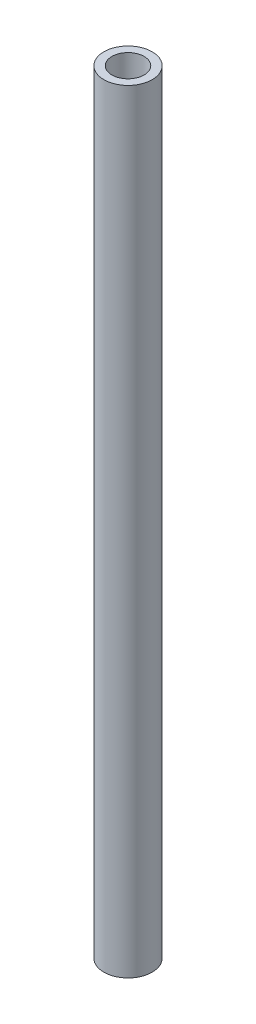
ISO-10303-21;
HEADER;
FILE_DESCRIPTION(('STEP AP214'),'2;1');
FILE_NAME('part.step','',(''),(''),'','','');
FILE_SCHEMA(('AUTOMOTIVE_DESIGN { 1 0 10303 214 1 1 1 1 }'));
ENDSEC;
DATA;
#1=APPLICATION_CONTEXT('core data for automotive mechanical design processes');
#2=APPLICATION_PROTOCOL_DEFINITION('international standard','automotive_design',2000,#1);
#3=PRODUCT_CONTEXT('',#1,'mechanical');
#4=PRODUCT('Part','Part','',(#3));
#5=PRODUCT_RELATED_PRODUCT_CATEGORY('part','',(#4));
#6=PRODUCT_DEFINITION_FORMATION('','',#4);
#7=PRODUCT_DEFINITION_CONTEXT('part definition',#1,'design');
#8=PRODUCT_DEFINITION('design','',#6,#7);
#9=PRODUCT_DEFINITION_SHAPE('','',#8);
#10=(LENGTH_UNIT() NAMED_UNIT(*) SI_UNIT(.MILLI.,.METRE.));
#11=(NAMED_UNIT(*) PLANE_ANGLE_UNIT() SI_UNIT($,.RADIAN.));
#12=(NAMED_UNIT(*) SI_UNIT($,.STERADIAN.) SOLID_ANGLE_UNIT());
#13=UNCERTAINTY_MEASURE_WITH_UNIT(LENGTH_MEASURE(1.E-05),#10,'distance_accuracy_value','');
#14=(GEOMETRIC_REPRESENTATION_CONTEXT(3) GLOBAL_UNCERTAINTY_ASSIGNED_CONTEXT((#13)) GLOBAL_UNIT_ASSIGNED_CONTEXT((#10,
#11,#12)) REPRESENTATION_CONTEXT('',''));
#15=CARTESIAN_POINT('',(0.,0.,0.));
#16=DIRECTION('',(0.,0.,1.));
#17=DIRECTION('',(1.,0.,0.));
#18=AXIS2_PLACEMENT_3D('',#15,#16,#17);
#19=CARTESIAN_POINT('',(0.,304.8,0.));
#20=DIRECTION('',(0.,1.,0.));
#21=DIRECTION('',(0.,0.,1.));
#22=AXIS2_PLACEMENT_3D('',#19,#20,#21);
#23=PLANE('',#22);
#24=CARTESIAN_POINT('',(0.,304.8,0.));
#25=DIRECTION('',(0.,1.,0.));
#26=DIRECTION('',(0.,0.,1.));
#27=AXIS2_PLACEMENT_3D('',#24,#25,#26);
#28=CIRCLE('',#27,9.525);
#29=CARTESIAN_POINT('',(0.,304.8,-9.525));
#30=VERTEX_POINT('',#29);
#31=EDGE_CURVE('E10',#30,#30,#28,.T.);
#32=ORIENTED_EDGE('',*,*,#31,.T.);
#33=EDGE_LOOP('',(#32));
#34=FACE_BOUND('',#33,.T.);
#35=CARTESIAN_POINT('',(0.,304.8,0.));
#36=DIRECTION('',(0.,1.,0.));
#37=DIRECTION('',(0.,0.,1.));
#38=AXIS2_PLACEMENT_3D('',#35,#36,#37);
#39=CIRCLE('',#38,6.35);
#40=CARTESIAN_POINT('',(0.,304.8,-6.35));
#41=VERTEX_POINT('',#40);
#42=EDGE_CURVE('E42',#41,#41,#39,.T.);
#43=ORIENTED_EDGE('',*,*,#42,.F.);
#44=EDGE_LOOP('',(#43));
#45=FACE_BOUND('',#44,.T.);
#46=ADVANCED_FACE('F31',(#34,#45),#23,.T.);
#47=CARTESIAN_POINT('',(0.,0.,0.));
#48=DIRECTION('',(0.,1.,0.));
#49=DIRECTION('',(0.,0.,1.));
#50=AXIS2_PLACEMENT_3D('',#47,#48,#49);
#51=PLANE('',#50);
#52=CARTESIAN_POINT('',(0.,0.,0.));
#53=DIRECTION('',(0.,1.,0.));
#54=DIRECTION('',(0.,0.,1.));
#55=AXIS2_PLACEMENT_3D('',#52,#53,#54);
#56=CIRCLE('',#55,9.525);
#57=CARTESIAN_POINT('',(0.,0.,-9.525));
#58=VERTEX_POINT('',#57);
#59=EDGE_CURVE('E35',#58,#58,#56,.T.);
#60=ORIENTED_EDGE('',*,*,#59,.F.);
#61=EDGE_LOOP('',(#60));
#62=FACE_BOUND('',#61,.T.);
#63=CARTESIAN_POINT('',(0.,0.,0.));
#64=DIRECTION('',(0.,1.,0.));
#65=DIRECTION('',(0.,0.,1.));
#66=AXIS2_PLACEMENT_3D('',#63,#64,#65);
#67=CIRCLE('',#66,6.35);
#68=CARTESIAN_POINT('',(0.,0.,-6.35));
#69=VERTEX_POINT('',#68);
#70=EDGE_CURVE('E44',#69,#69,#67,.T.);
#71=ORIENTED_EDGE('',*,*,#70,.T.);
#72=EDGE_LOOP('',(#71));
#73=FACE_BOUND('',#72,.T.);
#74=ADVANCED_FACE('F54',(#62,#73),#51,.F.);
#75=CARTESIAN_POINT('',(0.,304.8,0.));
#76=DIRECTION('',(0.,-1.,0.));
#77=DIRECTION('',(0.,0.,-1.));
#78=AXIS2_PLACEMENT_3D('',#75,#76,#77);
#79=CYLINDRICAL_SURFACE('',#78,9.525);
#80=CARTESIAN_POINT('',(0.,304.8,-9.525));
#81=CARTESIAN_POINT('',(0.,301.625,-9.525));
#82=CARTESIAN_POINT('',(0.,298.45,-9.525));
#83=CARTESIAN_POINT('',(0.,292.1,-9.525));
#84=CARTESIAN_POINT('',(0.,288.925,-9.525));
#85=CARTESIAN_POINT('',(0.,282.575,-9.525));
#86=CARTESIAN_POINT('',(0.,279.4,-9.525));
#87=CARTESIAN_POINT('',(0.,273.05,-9.525));
#88=CARTESIAN_POINT('',(0.,269.875,-9.525));
#89=CARTESIAN_POINT('',(0.,263.525,-9.525));
#90=CARTESIAN_POINT('',(0.,260.35,-9.525));
#91=CARTESIAN_POINT('',(0.,254.,-9.525));
#92=CARTESIAN_POINT('',(0.,250.825,-9.525));
#93=CARTESIAN_POINT('',(0.,244.475,-9.525));
#94=CARTESIAN_POINT('',(0.,241.3,-9.525));
#95=CARTESIAN_POINT('',(0.,234.95,-9.525));
#96=CARTESIAN_POINT('',(0.,231.775,-9.525));
#97=CARTESIAN_POINT('',(0.,225.425,-9.525));
#98=CARTESIAN_POINT('',(0.,222.25,-9.525));
#99=CARTESIAN_POINT('',(0.,215.9,-9.525));
#100=CARTESIAN_POINT('',(0.,212.725,-9.525));
#101=CARTESIAN_POINT('',(0.,206.375,-9.525));
#102=CARTESIAN_POINT('',(0.,203.2,-9.525));
#103=CARTESIAN_POINT('',(0.,196.85,-9.525));
#104=CARTESIAN_POINT('',(0.,193.675,-9.525));
#105=CARTESIAN_POINT('',(0.,187.325,-9.525));
#106=CARTESIAN_POINT('',(0.,184.15,-9.525));
#107=CARTESIAN_POINT('',(0.,177.8,-9.525));
#108=CARTESIAN_POINT('',(0.,174.625,-9.525));
#109=CARTESIAN_POINT('',(0.,168.275,-9.525));
#110=CARTESIAN_POINT('',(0.,165.1,-9.525));
#111=CARTESIAN_POINT('',(0.,158.75,-9.525));
#112=CARTESIAN_POINT('',(0.,155.575,-9.525));
#113=CARTESIAN_POINT('',(0.,149.225,-9.525));
#114=CARTESIAN_POINT('',(0.,146.05,-9.525));
#115=CARTESIAN_POINT('',(0.,139.7,-9.525));
#116=CARTESIAN_POINT('',(0.,136.525,-9.525));
#117=CARTESIAN_POINT('',(0.,130.175,-9.525));
#118=CARTESIAN_POINT('',(0.,127.,-9.525));
#119=CARTESIAN_POINT('',(0.,120.65,-9.525));
#120=CARTESIAN_POINT('',(0.,117.475,-9.525));
#121=CARTESIAN_POINT('',(0.,111.125,-9.525));
#122=CARTESIAN_POINT('',(0.,107.95,-9.525));
#123=CARTESIAN_POINT('',(0.,101.6,-9.525));
#124=CARTESIAN_POINT('',(0.,98.425,-9.525));
#125=CARTESIAN_POINT('',(0.,92.075,-9.525));
#126=CARTESIAN_POINT('',(0.,88.9,-9.525));
#127=CARTESIAN_POINT('',(0.,82.55,-9.525));
#128=CARTESIAN_POINT('',(0.,79.375,-9.525));
#129=CARTESIAN_POINT('',(0.,73.025,-9.525));
#130=CARTESIAN_POINT('',(0.,69.85,-9.525));
#131=CARTESIAN_POINT('',(0.,63.5,-9.525));
#132=CARTESIAN_POINT('',(0.,60.325,-9.525));
#133=CARTESIAN_POINT('',(0.,53.975,-9.525));
#134=CARTESIAN_POINT('',(0.,50.8,-9.525));
#135=CARTESIAN_POINT('',(0.,44.45,-9.525));
#136=CARTESIAN_POINT('',(0.,41.275,-9.525));
#137=CARTESIAN_POINT('',(0.,34.925,-9.525));
#138=CARTESIAN_POINT('',(0.,31.75,-9.525));
#139=CARTESIAN_POINT('',(0.,25.4,-9.525));
#140=CARTESIAN_POINT('',(0.,22.225,-9.525));
#141=CARTESIAN_POINT('',(0.,15.875,-9.525));
#142=CARTESIAN_POINT('',(0.,12.7,-9.525));
#143=CARTESIAN_POINT('',(0.,6.35,-9.525));
#144=CARTESIAN_POINT('',(0.,3.175,-9.525));
#145=CARTESIAN_POINT('',(0.,0.,-9.525));
#146=B_SPLINE_CURVE_WITH_KNOTS('',3,(#80,#81,#82,#83,#84,#85,#86,#87,#88,#89,#90,#91,#92,#93,
#94,#95,#96,#97,#98,#99,#100,#101,#102,#103,#104,#105,#106,#107,#108,#109,#110,#111,#112,#113,
#114,#115,#116,#117,#118,#119,#120,#121,#122,#123,#124,#125,#126,#127,#128,#129,#130,#131,#132,
#133,#134,#135,#136,#137,#138,#139,#140,#141,#142,#143,#144,#145),.UNSPECIFIED.,.F.,.F.,(4,2,2,
2,2,2,2,2,2,2,2,2,2,2,2,2,2,2,2,2,2,2,2,2,2,2,2,2,2,2,2,2,4),(0.,9.52499999999995,19.05,28.575,
38.1,47.625,57.15,66.675,76.2,85.725,95.2499999999999,104.775,114.3,123.825,133.35,142.875,
152.4,161.925,171.45,180.975,190.5,200.025,209.55,219.075,228.6,238.125,247.65,257.175,266.7,
276.225,285.75,295.275,304.8),.UNSPECIFIED.);
#147=EDGE_CURVE('BSEAM33',#30,#58,#146,.T.);
#148=ORIENTED_EDGE('',*,*,#31,.F.);
#149=ORIENTED_EDGE('',*,*,#59,.T.);
#150=ORIENTED_EDGE('',*,*,#147,.T.);
#151=ORIENTED_EDGE('',*,*,#147,.F.);
#152=EDGE_LOOP('',(#148,#150,#149,#151));
#153=FACE_BOUND('',#152,.T.);
#154=ADVANCED_FACE('F33',(#153),#79,.T.);
#155=CARTESIAN_POINT('',(0.,304.8,0.));
#156=DIRECTION('',(0.,-1.,0.));
#157=DIRECTION('',(0.,0.,-1.));
#158=AXIS2_PLACEMENT_3D('',#155,#156,#157);
#159=CYLINDRICAL_SURFACE('',#158,6.35);
#160=CARTESIAN_POINT('',(0.,304.8,-6.35));
#161=CARTESIAN_POINT('',(0.,301.625,-6.35));
#162=CARTESIAN_POINT('',(0.,298.45,-6.35));
#163=CARTESIAN_POINT('',(0.,292.1,-6.35));
#164=CARTESIAN_POINT('',(0.,288.925,-6.35));
#165=CARTESIAN_POINT('',(0.,282.575,-6.35));
#166=CARTESIAN_POINT('',(0.,279.4,-6.35));
#167=CARTESIAN_POINT('',(0.,273.05,-6.35));
#168=CARTESIAN_POINT('',(0.,269.875,-6.35));
#169=CARTESIAN_POINT('',(0.,263.525,-6.35));
#170=CARTESIAN_POINT('',(0.,260.35,-6.35));
#171=CARTESIAN_POINT('',(0.,254.,-6.35));
#172=CARTESIAN_POINT('',(0.,250.825,-6.35));
#173=CARTESIAN_POINT('',(0.,244.475,-6.35));
#174=CARTESIAN_POINT('',(0.,241.3,-6.35));
#175=CARTESIAN_POINT('',(0.,234.95,-6.35));
#176=CARTESIAN_POINT('',(0.,231.775,-6.35));
#177=CARTESIAN_POINT('',(0.,225.425,-6.35));
#178=CARTESIAN_POINT('',(0.,222.25,-6.35));
#179=CARTESIAN_POINT('',(0.,215.9,-6.35));
#180=CARTESIAN_POINT('',(0.,212.725,-6.35));
#181=CARTESIAN_POINT('',(0.,206.375,-6.35));
#182=CARTESIAN_POINT('',(0.,203.2,-6.35));
#183=CARTESIAN_POINT('',(0.,196.85,-6.35));
#184=CARTESIAN_POINT('',(0.,193.675,-6.35));
#185=CARTESIAN_POINT('',(0.,187.325,-6.35));
#186=CARTESIAN_POINT('',(0.,184.15,-6.35));
#187=CARTESIAN_POINT('',(0.,177.8,-6.35));
#188=CARTESIAN_POINT('',(0.,174.625,-6.35));
#189=CARTESIAN_POINT('',(0.,168.275,-6.35));
#190=CARTESIAN_POINT('',(0.,165.1,-6.35));
#191=CARTESIAN_POINT('',(0.,158.75,-6.35));
#192=CARTESIAN_POINT('',(0.,155.575,-6.35));
#193=CARTESIAN_POINT('',(0.,149.225,-6.35));
#194=CARTESIAN_POINT('',(0.,146.05,-6.35));
#195=CARTESIAN_POINT('',(0.,139.7,-6.35));
#196=CARTESIAN_POINT('',(0.,136.525,-6.35));
#197=CARTESIAN_POINT('',(0.,130.175,-6.35));
#198=CARTESIAN_POINT('',(0.,127.,-6.35));
#199=CARTESIAN_POINT('',(0.,120.65,-6.35));
#200=CARTESIAN_POINT('',(0.,117.475,-6.35));
#201=CARTESIAN_POINT('',(0.,111.125,-6.35));
#202=CARTESIAN_POINT('',(0.,107.95,-6.35));
#203=CARTESIAN_POINT('',(0.,101.6,-6.35));
#204=CARTESIAN_POINT('',(0.,98.425,-6.35));
#205=CARTESIAN_POINT('',(0.,92.075,-6.35));
#206=CARTESIAN_POINT('',(0.,88.9,-6.35));
#207=CARTESIAN_POINT('',(0.,82.55,-6.35));
#208=CARTESIAN_POINT('',(0.,79.375,-6.35));
#209=CARTESIAN_POINT('',(0.,73.025,-6.35));
#210=CARTESIAN_POINT('',(0.,69.85,-6.35));
#211=CARTESIAN_POINT('',(0.,63.5,-6.35));
#212=CARTESIAN_POINT('',(0.,60.325,-6.35));
#213=CARTESIAN_POINT('',(0.,53.975,-6.35));
#214=CARTESIAN_POINT('',(0.,50.8,-6.35));
#215=CARTESIAN_POINT('',(0.,44.45,-6.35));
#216=CARTESIAN_POINT('',(0.,41.275,-6.35));
#217=CARTESIAN_POINT('',(0.,34.925,-6.35));
#218=CARTESIAN_POINT('',(0.,31.75,-6.35));
#219=CARTESIAN_POINT('',(0.,25.4,-6.35));
#220=CARTESIAN_POINT('',(0.,22.225,-6.35));
#221=CARTESIAN_POINT('',(0.,15.875,-6.35));
#222=CARTESIAN_POINT('',(0.,12.7,-6.35));
#223=CARTESIAN_POINT('',(0.,6.35,-6.35));
#224=CARTESIAN_POINT('',(0.,3.175,-6.35));
#225=CARTESIAN_POINT('',(0.,0.,-6.35));
#226=B_SPLINE_CURVE_WITH_KNOTS('',3,(#160,#161,#162,#163,#164,#165,#166,#167,#168,#169,#170,
#171,#172,#173,#174,#175,#176,#177,#178,#179,#180,#181,#182,#183,#184,#185,#186,#187,#188,#189,
#190,#191,#192,#193,#194,#195,#196,#197,#198,#199,#200,#201,#202,#203,#204,#205,#206,#207,#208,
#209,#210,#211,#212,#213,#214,#215,#216,#217,#218,#219,#220,#221,#222,#223,#224,#225),
.UNSPECIFIED.,.F.,.F.,(4,2,2,2,2,2,2,2,2,2,2,2,2,2,2,2,2,2,2,2,2,2,2,2,2,2,2,2,2,2,2,2,4),(0.,
9.52500000000001,19.05,28.575,38.1,47.625,57.15,66.675,76.2,85.7250000000001,95.2500000000001,
104.775,114.3,123.825,133.35,142.875,152.4,161.925,171.45,180.975,190.5,200.025,209.55,219.075,
228.6,238.125,247.65,257.175,266.7,276.225,285.75,295.275,304.8),.UNSPECIFIED.);
#227=EDGE_CURVE('BSEAM50',#41,#69,#226,.T.);
#228=ORIENTED_EDGE('',*,*,#42,.T.);
#229=ORIENTED_EDGE('',*,*,#70,.F.);
#230=ORIENTED_EDGE('',*,*,#227,.T.);
#231=ORIENTED_EDGE('',*,*,#227,.F.);
#232=EDGE_LOOP('',(#228,#230,#229,#231));
#233=FACE_BOUND('',#232,.T.);
#234=ADVANCED_FACE('F50',(#233),#159,.F.);
#235=CLOSED_SHELL('',(#46,#74,#154,#234));
#236=MANIFOLD_SOLID_BREP('B2',#235);
#237=ADVANCED_BREP_SHAPE_REPRESENTATION('',(#18,#236),#14);
#238=SHAPE_DEFINITION_REPRESENTATION(#9,#237);
ENDSEC;
END-ISO-10303-21;
